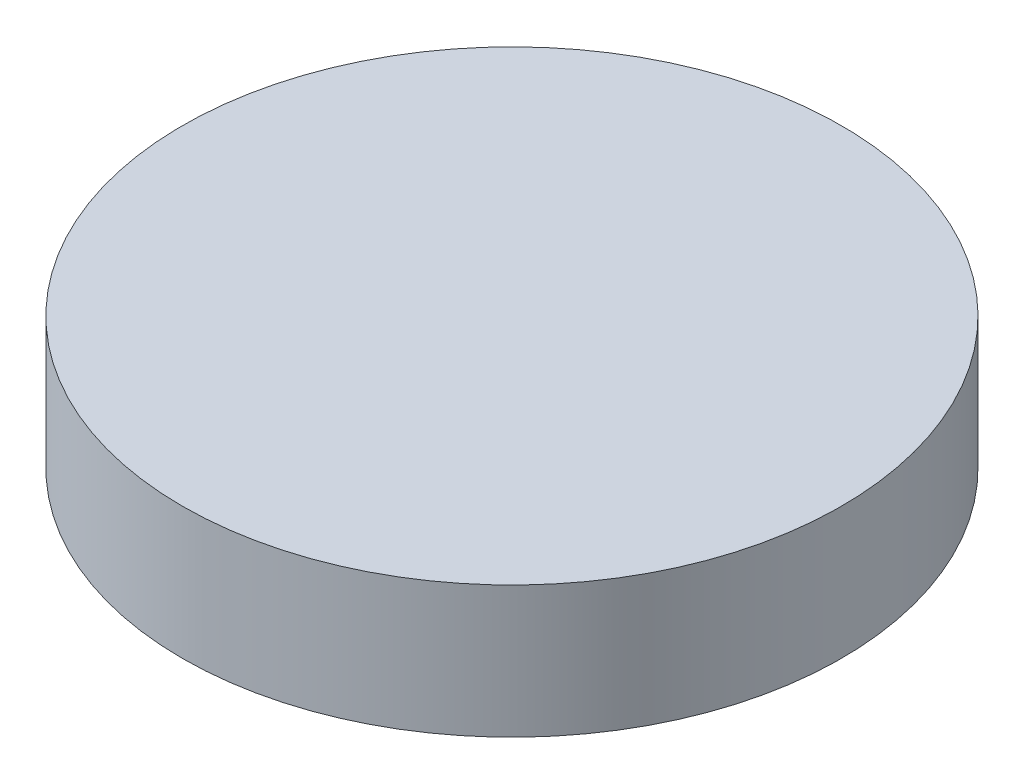
ISO-10303-21;
HEADER;
FILE_DESCRIPTION(('STEP AP214'),'2;1');
FILE_NAME('part.step','',(''),(''),'','','');
FILE_SCHEMA(('AUTOMOTIVE_DESIGN { 1 0 10303 214 1 1 1 1 }'));
ENDSEC;
DATA;
#1=APPLICATION_CONTEXT('core data for automotive mechanical design processes');
#2=APPLICATION_PROTOCOL_DEFINITION('international standard','automotive_design',2000,#1);
#3=PRODUCT_CONTEXT('',#1,'mechanical');
#4=PRODUCT('Part','Part','',(#3));
#5=PRODUCT_RELATED_PRODUCT_CATEGORY('part','',(#4));
#6=PRODUCT_DEFINITION_FORMATION('','',#4);
#7=PRODUCT_DEFINITION_CONTEXT('part definition',#1,'design');
#8=PRODUCT_DEFINITION('design','',#6,#7);
#9=PRODUCT_DEFINITION_SHAPE('','',#8);
#10=(LENGTH_UNIT() NAMED_UNIT(*) SI_UNIT(.MILLI.,.METRE.));
#11=(NAMED_UNIT(*) PLANE_ANGLE_UNIT() SI_UNIT($,.RADIAN.));
#12=(NAMED_UNIT(*) SI_UNIT($,.STERADIAN.) SOLID_ANGLE_UNIT());
#13=UNCERTAINTY_MEASURE_WITH_UNIT(LENGTH_MEASURE(1.E-05),#10,'distance_accuracy_value','');
#14=(GEOMETRIC_REPRESENTATION_CONTEXT(3) GLOBAL_UNCERTAINTY_ASSIGNED_CONTEXT((#13)) GLOBAL_UNIT_ASSIGNED_CONTEXT((#10,
#11,#12)) REPRESENTATION_CONTEXT('',''));
#15=CARTESIAN_POINT('',(0.,0.,0.));
#16=DIRECTION('',(0.,0.,1.));
#17=DIRECTION('',(1.,0.,0.));
#18=AXIS2_PLACEMENT_3D('',#15,#16,#17);
#19=CARTESIAN_POINT('',(0.,-3.,0.));
#20=DIRECTION('',(0.,1.,0.));
#21=DIRECTION('',(0.,0.,1.));
#22=AXIS2_PLACEMENT_3D('',#19,#20,#21);
#23=CYLINDRICAL_SURFACE('',#22,15.);
#24=CARTESIAN_POINT('',(0.,-3.,0.));
#25=DIRECTION('',(0.,1.,0.));
#26=DIRECTION('',(0.,0.,1.));
#27=AXIS2_PLACEMENT_3D('',#24,#25,#26);
#28=CIRCLE('',#27,15.);
#29=CARTESIAN_POINT('',(0.,-3.,15.));
#30=VERTEX_POINT('',#29);
#31=EDGE_CURVE('E10',#30,#30,#28,.T.);
#32=ORIENTED_EDGE('',*,*,#31,.T.);
#33=EDGE_LOOP('',(#32));
#34=FACE_BOUND('',#33,.T.);
#35=CARTESIAN_POINT('',(0.,3.,0.));
#36=DIRECTION('',(0.,1.,0.));
#37=DIRECTION('',(0.,0.,1.));
#38=AXIS2_PLACEMENT_3D('',#35,#36,#37);
#39=CIRCLE('',#38,15.);
#40=CARTESIAN_POINT('',(0.,3.,15.));
#41=VERTEX_POINT('',#40);
#42=EDGE_CURVE('E48',#41,#41,#39,.T.);
#43=ORIENTED_EDGE('',*,*,#42,.F.);
#44=EDGE_LOOP('',(#43));
#45=FACE_BOUND('',#44,.T.);
#46=ADVANCED_FACE('F41',(#34,#45),#23,.T.);
#47=CARTESIAN_POINT('',(0.,-3.,0.));
#48=DIRECTION('',(0.,1.,0.));
#49=DIRECTION('',(0.,0.,1.));
#50=AXIS2_PLACEMENT_3D('',#47,#48,#49);
#51=PLANE('',#50);
#52=ORIENTED_EDGE('',*,*,#31,.F.);
#53=EDGE_LOOP('',(#52));
#54=FACE_BOUND('',#53,.T.);
#55=ADVANCED_FACE('F58',(#54),#51,.F.);
#56=CARTESIAN_POINT('',(0.,3.,0.));
#57=DIRECTION('',(0.,1.,0.));
#58=DIRECTION('',(0.,0.,1.));
#59=AXIS2_PLACEMENT_3D('',#56,#57,#58);
#60=PLANE('',#59);
#61=ORIENTED_EDGE('',*,*,#42,.T.);
#62=EDGE_LOOP('',(#61));
#63=FACE_BOUND('',#62,.T.);
#64=ADVANCED_FACE('F55',(#63),#60,.T.);
#65=CLOSED_SHELL('',(#46,#55,#64));
#66=MANIFOLD_SOLID_BREP('B2',#65);
#67=ADVANCED_BREP_SHAPE_REPRESENTATION('',(#18,#66),#14);
#68=SHAPE_DEFINITION_REPRESENTATION(#9,#67);
ENDSEC;
END-ISO-10303-21;
